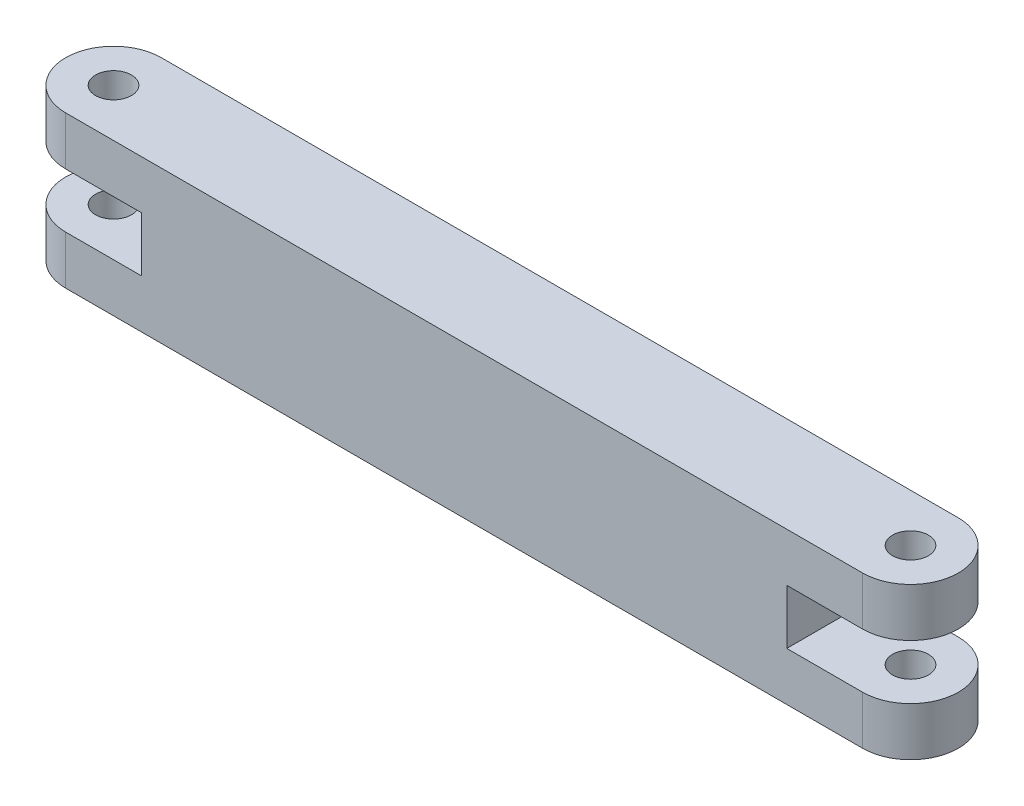
ISO-10303-21;
HEADER;
FILE_DESCRIPTION(('STEP AP214'),'2;1');
FILE_NAME('part.step','',(''),(''),'','','');
FILE_SCHEMA(('AUTOMOTIVE_DESIGN { 1 0 10303 214 1 1 1 1 }'));
ENDSEC;
DATA;
#1=APPLICATION_CONTEXT('core data for automotive mechanical design processes');
#2=APPLICATION_PROTOCOL_DEFINITION('international standard','automotive_design',2000,#1);
#3=PRODUCT_CONTEXT('',#1,'mechanical');
#4=PRODUCT('Part','Part','',(#3));
#5=PRODUCT_RELATED_PRODUCT_CATEGORY('part','',(#4));
#6=PRODUCT_DEFINITION_FORMATION('','',#4);
#7=PRODUCT_DEFINITION_CONTEXT('part definition',#1,'design');
#8=PRODUCT_DEFINITION('design','',#6,#7);
#9=PRODUCT_DEFINITION_SHAPE('','',#8);
#10=(LENGTH_UNIT() NAMED_UNIT(*) SI_UNIT(.MILLI.,.METRE.));
#11=(NAMED_UNIT(*) PLANE_ANGLE_UNIT() SI_UNIT($,.RADIAN.));
#12=(NAMED_UNIT(*) SI_UNIT($,.STERADIAN.) SOLID_ANGLE_UNIT());
#13=UNCERTAINTY_MEASURE_WITH_UNIT(LENGTH_MEASURE(1.E-05),#10,'distance_accuracy_value','');
#14=(GEOMETRIC_REPRESENTATION_CONTEXT(3) GLOBAL_UNCERTAINTY_ASSIGNED_CONTEXT((#13)) GLOBAL_UNIT_ASSIGNED_CONTEXT((#10,
#11,#12)) REPRESENTATION_CONTEXT('',''));
#15=CARTESIAN_POINT('',(0.,0.,0.));
#16=DIRECTION('',(0.,0.,1.));
#17=DIRECTION('',(1.,0.,0.));
#18=AXIS2_PLACEMENT_3D('',#15,#16,#17);
#19=CARTESIAN_POINT('',(0.,19.05,6.));
#20=DIRECTION('',(0.,0.,-1.));
#21=DIRECTION('',(-1.,0.,0.));
#22=AXIS2_PLACEMENT_3D('',#19,#20,#21);
#23=PLANE('',#22);
#24=DIRECTION('',(1.,0.,0.));
#25=VECTOR('',#24,1.);
#26=CARTESIAN_POINT('',(0.,6.096,6.));
#27=LINE('',#26,#25);
#28=CARTESIAN_POINT('',(90.475,6.09600000000001,6.));
#29=VERTEX_POINT('',#28);
#30=CARTESIAN_POINT('',(100.,6.09600000000001,6.));
#31=VERTEX_POINT('',#30);
#32=EDGE_CURVE('E156',#29,#31,#27,.T.);
#33=ORIENTED_EDGE('',*,*,#32,.F.);
#34=DIRECTION('',(0.,-1.,0.));
#35=VECTOR('',#34,1.);
#36=CARTESIAN_POINT('',(90.475,19.05,6.));
#37=LINE('',#36,#35);
#38=CARTESIAN_POINT('',(90.475,12.954,6.));
#39=VERTEX_POINT('',#38);
#40=EDGE_CURVE('E158',#39,#29,#37,.T.);
#41=ORIENTED_EDGE('',*,*,#40,.F.);
#42=DIRECTION('',(-1.,0.,0.));
#43=VECTOR('',#42,1.);
#44=CARTESIAN_POINT('',(0.,12.954,6.));
#45=LINE('',#44,#43);
#46=CARTESIAN_POINT('',(100.,12.954,6.));
#47=VERTEX_POINT('',#46);
#48=EDGE_CURVE('E131',#47,#39,#45,.T.);
#49=ORIENTED_EDGE('',*,*,#48,.F.);
#50=DIRECTION('',(0.,-1.,0.));
#51=VECTOR('',#50,1.);
#52=CARTESIAN_POINT('',(100.,19.05,6.));
#53=LINE('',#52,#51);
#54=CARTESIAN_POINT('',(100.,19.05,6.));
#55=VERTEX_POINT('',#54);
#56=EDGE_CURVE('E226',#55,#47,#53,.T.);
#57=ORIENTED_EDGE('',*,*,#56,.F.);
#58=DIRECTION('',(1.,0.,0.));
#59=VECTOR('',#58,1.);
#60=CARTESIAN_POINT('',(0.,19.05,6.));
#61=LINE('',#60,#59);
#62=CARTESIAN_POINT('',(0.,19.05,6.));
#63=VERTEX_POINT('',#62);
#64=EDGE_CURVE('E202',#63,#55,#61,.T.);
#65=ORIENTED_EDGE('',*,*,#64,.F.);
#66=DIRECTION('',(0.,-1.,0.));
#67=VECTOR('',#66,1.);
#68=CARTESIAN_POINT('',(0.,19.05,6.));
#69=LINE('',#68,#67);
#70=CARTESIAN_POINT('',(0.,12.954,6.));
#71=VERTEX_POINT('',#70);
#72=EDGE_CURVE('E11',#63,#71,#69,.T.);
#73=ORIENTED_EDGE('',*,*,#72,.T.);
#74=DIRECTION('',(1.,0.,0.));
#75=VECTOR('',#74,1.);
#76=CARTESIAN_POINT('',(0.,12.954,6.));
#77=LINE('',#76,#75);
#78=CARTESIAN_POINT('',(9.525,12.954,6.));
#79=VERTEX_POINT('',#78);
#80=EDGE_CURVE('E172',#71,#79,#77,.T.);
#81=ORIENTED_EDGE('',*,*,#80,.T.);
#82=DIRECTION('',(0.,-1.,0.));
#83=VECTOR('',#82,1.);
#84=CARTESIAN_POINT('',(9.525,19.05,6.));
#85=LINE('',#84,#83);
#86=CARTESIAN_POINT('',(9.525,6.09600000000001,6.));
#87=VERTEX_POINT('',#86);
#88=EDGE_CURVE('E183',#79,#87,#85,.T.);
#89=ORIENTED_EDGE('',*,*,#88,.T.);
#90=DIRECTION('',(-1.,0.,0.));
#91=VECTOR('',#90,1.);
#92=CARTESIAN_POINT('',(0.,6.09600000000001,6.));
#93=LINE('',#92,#91);
#94=CARTESIAN_POINT('',(0.,6.09600000000001,6.));
#95=VERTEX_POINT('',#94);
#96=EDGE_CURVE('E177',#87,#95,#93,.T.);
#97=ORIENTED_EDGE('',*,*,#96,.T.);
#98=CARTESIAN_POINT('',(0.,0.,6.));
#99=VERTEX_POINT('',#98);
#100=EDGE_CURVE('E41',#95,#99,#69,.T.);
#101=ORIENTED_EDGE('',*,*,#100,.T.);
#102=DIRECTION('',(1.,0.,0.));
#103=VECTOR('',#102,1.);
#104=CARTESIAN_POINT('',(0.,0.,6.));
#105=LINE('',#104,#103);
#106=CARTESIAN_POINT('',(100.,0.,6.));
#107=VERTEX_POINT('',#106);
#108=EDGE_CURVE('E212',#99,#107,#105,.T.);
#109=ORIENTED_EDGE('',*,*,#108,.T.);
#110=EDGE_CURVE('E225',#31,#107,#53,.T.);
#111=ORIENTED_EDGE('',*,*,#110,.F.);
#112=EDGE_LOOP('',(#33,#41,#49,#57,#65,#73,#81,#89,#97,#101,#109,#111));
#113=FACE_BOUND('',#112,.T.);
#114=ADVANCED_FACE('F32',(#113),#23,.F.);
#115=CARTESIAN_POINT('',(100.,19.05,0.));
#116=DIRECTION('',(0.,-1.,0.));
#117=DIRECTION('',(0.,0.,-1.));
#118=AXIS2_PLACEMENT_3D('',#115,#116,#117);
#119=CYLINDRICAL_SURFACE('',#118,6.);
#120=CARTESIAN_POINT('',(100.,6.09600000000001,0.));
#121=DIRECTION('',(0.,1.,0.));
#122=DIRECTION('',(-1.,0.,0.));
#123=AXIS2_PLACEMENT_3D('',#120,#121,#122);
#124=CIRCLE('',#123,6.);
#125=CARTESIAN_POINT('',(100.,6.09600000000001,-6.));
#126=VERTEX_POINT('',#125);
#127=EDGE_CURVE('E154',#31,#126,#124,.T.);
#128=ORIENTED_EDGE('',*,*,#127,.F.);
#129=ORIENTED_EDGE('',*,*,#110,.T.);
#130=CARTESIAN_POINT('',(100.,0.,0.));
#131=DIRECTION('',(0.,1.,0.));
#132=DIRECTION('',(0.,0.,1.));
#133=AXIS2_PLACEMENT_3D('',#130,#131,#132);
#134=CIRCLE('',#133,6.);
#135=CARTESIAN_POINT('',(100.,0.,-6.));
#136=VERTEX_POINT('',#135);
#137=EDGE_CURVE('E215',#107,#136,#134,.T.);
#138=ORIENTED_EDGE('',*,*,#137,.T.);
#139=DIRECTION('',(0.,-1.,0.));
#140=VECTOR('',#139,1.);
#141=CARTESIAN_POINT('',(100.,19.05,-6.));
#142=LINE('',#141,#140);
#143=EDGE_CURVE('E223',#126,#136,#142,.T.);
#144=ORIENTED_EDGE('',*,*,#143,.F.);
#145=EDGE_LOOP('',(#128,#129,#138,#144));
#146=FACE_BOUND('',#145,.T.);
#147=ADVANCED_FACE('F247',(#146),#119,.T.);
#148=CARTESIAN_POINT('',(100.,12.954,0.));
#149=DIRECTION('',(0.,-1.,0.));
#150=DIRECTION('',(1.,0.,0.));
#151=AXIS2_PLACEMENT_3D('',#148,#149,#150);
#152=CIRCLE('',#151,6.);
#153=CARTESIAN_POINT('',(100.,12.954,-6.));
#154=VERTEX_POINT('',#153);
#155=EDGE_CURVE('E151',#154,#47,#152,.T.);
#156=ORIENTED_EDGE('',*,*,#155,.F.);
#157=CARTESIAN_POINT('',(100.,19.05,-6.));
#158=VERTEX_POINT('',#157);
#159=EDGE_CURVE('E146',#158,#154,#142,.T.);
#160=ORIENTED_EDGE('',*,*,#159,.F.);
#161=CARTESIAN_POINT('',(100.,19.05,0.));
#162=DIRECTION('',(0.,1.,0.));
#163=DIRECTION('',(0.,0.,1.));
#164=AXIS2_PLACEMENT_3D('',#161,#162,#163);
#165=CIRCLE('',#164,6.);
#166=EDGE_CURVE('E205',#55,#158,#165,.T.);
#167=ORIENTED_EDGE('',*,*,#166,.F.);
#168=ORIENTED_EDGE('',*,*,#56,.T.);
#169=EDGE_LOOP('',(#156,#160,#167,#168));
#170=FACE_BOUND('',#169,.T.);
#171=ADVANCED_FACE('F252',(#170),#119,.T.);
#172=CARTESIAN_POINT('',(0.,19.05,-6.));
#173=DIRECTION('',(0.,0.,1.));
#174=DIRECTION('',(1.,0.,0.));
#175=AXIS2_PLACEMENT_3D('',#172,#173,#174);
#176=PLANE('',#175);
#177=DIRECTION('',(1.,0.,0.));
#178=VECTOR('',#177,1.);
#179=CARTESIAN_POINT('',(113.5,6.09600000000001,-6.));
#180=LINE('',#179,#178);
#181=CARTESIAN_POINT('',(90.475,6.09600000000001,-6.));
#182=VERTEX_POINT('',#181);
#183=EDGE_CURVE('E49',#182,#126,#180,.T.);
#184=ORIENTED_EDGE('',*,*,#183,.T.);
#185=ORIENTED_EDGE('',*,*,#143,.T.);
#186=DIRECTION('',(-1.,0.,0.));
#187=VECTOR('',#186,1.);
#188=CARTESIAN_POINT('',(0.,0.,-6.));
#189=LINE('',#188,#187);
#190=CARTESIAN_POINT('',(0.,0.,-6.));
#191=VERTEX_POINT('',#190);
#192=EDGE_CURVE('E203',#136,#191,#189,.T.);
#193=ORIENTED_EDGE('',*,*,#192,.T.);
#194=DIRECTION('',(0.,-1.,0.));
#195=VECTOR('',#194,1.);
#196=CARTESIAN_POINT('',(0.,19.05,-6.));
#197=LINE('',#196,#195);
#198=CARTESIAN_POINT('',(0.,6.09600000000001,-6.));
#199=VERTEX_POINT('',#198);
#200=EDGE_CURVE('E209',#199,#191,#197,.T.);
#201=ORIENTED_EDGE('',*,*,#200,.F.);
#202=DIRECTION('',(-1.,0.,0.));
#203=VECTOR('',#202,1.);
#204=CARTESIAN_POINT('',(-13.5,6.09600000000001,-6.));
#205=LINE('',#204,#203);
#206=CARTESIAN_POINT('',(9.525,6.09600000000001,-6.));
#207=VERTEX_POINT('',#206);
#208=EDGE_CURVE('E160',#207,#199,#205,.T.);
#209=ORIENTED_EDGE('',*,*,#208,.F.);
#210=DIRECTION('',(0.,-1.,0.));
#211=VECTOR('',#210,1.);
#212=CARTESIAN_POINT('',(9.525,12.954,-6.));
#213=LINE('',#212,#211);
#214=CARTESIAN_POINT('',(9.525,12.954,-6.));
#215=VERTEX_POINT('',#214);
#216=EDGE_CURVE('E164',#215,#207,#213,.T.);
#217=ORIENTED_EDGE('',*,*,#216,.F.);
#218=DIRECTION('',(1.,0.,0.));
#219=VECTOR('',#218,1.);
#220=CARTESIAN_POINT('',(-13.5,12.954,-6.));
#221=LINE('',#220,#219);
#222=CARTESIAN_POINT('',(0.,12.954,-6.));
#223=VERTEX_POINT('',#222);
#224=EDGE_CURVE('E162',#223,#215,#221,.T.);
#225=ORIENTED_EDGE('',*,*,#224,.F.);
#226=CARTESIAN_POINT('',(0.,19.05,-6.));
#227=VERTEX_POINT('',#226);
#228=EDGE_CURVE('E220',#227,#223,#197,.T.);
#229=ORIENTED_EDGE('',*,*,#228,.F.);
#230=DIRECTION('',(-1.,0.,0.));
#231=VECTOR('',#230,1.);
#232=CARTESIAN_POINT('',(0.,19.05,-6.));
#233=LINE('',#232,#231);
#234=EDGE_CURVE('E207',#158,#227,#233,.T.);
#235=ORIENTED_EDGE('',*,*,#234,.F.);
#236=ORIENTED_EDGE('',*,*,#159,.T.);
#237=DIRECTION('',(-1.,0.,0.));
#238=VECTOR('',#237,1.);
#239=CARTESIAN_POINT('',(113.5,12.954,-6.));
#240=LINE('',#239,#238);
#241=CARTESIAN_POINT('',(90.475,12.954,-6.));
#242=VERTEX_POINT('',#241);
#243=EDGE_CURVE('E128',#154,#242,#240,.T.);
#244=ORIENTED_EDGE('',*,*,#243,.T.);
#245=DIRECTION('',(0.,-1.,0.));
#246=VECTOR('',#245,1.);
#247=CARTESIAN_POINT('',(90.475,12.954,-6.));
#248=LINE('',#247,#246);
#249=EDGE_CURVE('E138',#242,#182,#248,.T.);
#250=ORIENTED_EDGE('',*,*,#249,.T.);
#251=EDGE_LOOP('',(#184,#185,#193,#201,#209,#217,#225,#229,#235,#236,#244,#250));
#252=FACE_BOUND('',#251,.T.);
#253=ADVANCED_FACE('F143',(#252),#176,.F.);
#254=CARTESIAN_POINT('',(100.,19.05,0.));
#255=DIRECTION('',(0.,-1.,0.));
#256=DIRECTION('',(0.,0.,-1.));
#257=AXIS2_PLACEMENT_3D('',#254,#255,#256);
#258=CYLINDRICAL_SURFACE('',#257,2.25);
#259=CARTESIAN_POINT('',(100.,0.,0.));
#260=DIRECTION('',(0.,1.,0.));
#261=DIRECTION('',(0.,0.,1.));
#262=AXIS2_PLACEMENT_3D('',#259,#260,#261);
#263=CIRCLE('',#262,2.25);
#264=CARTESIAN_POINT('',(100.,0.,-2.25));
#265=VERTEX_POINT('',#264);
#266=EDGE_CURVE('E186',#265,#265,#263,.T.);
#267=CARTESIAN_POINT('',(100.,6.09600000000001,0.));
#268=DIRECTION('',(0.,1.,0.));
#269=DIRECTION('',(-1.,0.,0.));
#270=AXIS2_PLACEMENT_3D('',#267,#268,#269);
#271=CIRCLE('',#270,2.25);
#272=CARTESIAN_POINT('',(100.,6.09600000000001,-2.25));
#273=VERTEX_POINT('',#272);
#274=EDGE_CURVE('E36',#273,#273,#271,.T.);
#275=CARTESIAN_POINT('',(100.,0.,-2.25));
#276=CARTESIAN_POINT('',(100.,0.0635,-2.25));
#277=CARTESIAN_POINT('',(100.,0.127,-2.25));
#278=CARTESIAN_POINT('',(100.,0.254,-2.25));
#279=CARTESIAN_POINT('',(100.,0.3175,-2.25));
#280=CARTESIAN_POINT('',(100.,0.444499999999999,-2.25));
#281=CARTESIAN_POINT('',(100.,0.507999999999999,-2.25));
#282=CARTESIAN_POINT('',(100.,0.635,-2.25));
#283=CARTESIAN_POINT('',(100.,0.698500000000001,-2.25));
#284=CARTESIAN_POINT('',(100.,0.825500000000002,-2.25));
#285=CARTESIAN_POINT('',(100.,0.889000000000002,-2.25));
#286=CARTESIAN_POINT('',(100.,1.016,-2.25));
#287=CARTESIAN_POINT('',(100.,1.0795,-2.25));
#288=CARTESIAN_POINT('',(100.,1.2065,-2.25));
#289=CARTESIAN_POINT('',(100.,1.27,-2.25));
#290=CARTESIAN_POINT('',(100.,1.397,-2.25));
#291=CARTESIAN_POINT('',(100.,1.4605,-2.25));
#292=CARTESIAN_POINT('',(100.,1.5875,-2.25));
#293=CARTESIAN_POINT('',(100.,1.651,-2.25));
#294=CARTESIAN_POINT('',(100.,1.778,-2.25));
#295=CARTESIAN_POINT('',(100.,1.8415,-2.25));
#296=CARTESIAN_POINT('',(100.,1.9685,-2.25));
#297=CARTESIAN_POINT('',(100.,2.032,-2.25));
#298=CARTESIAN_POINT('',(100.,2.159,-2.25));
#299=CARTESIAN_POINT('',(100.,2.2225,-2.25));
#300=CARTESIAN_POINT('',(100.,2.3495,-2.25));
#301=CARTESIAN_POINT('',(100.,2.413,-2.25));
#302=CARTESIAN_POINT('',(100.,2.54,-2.25));
#303=CARTESIAN_POINT('',(100.,2.6035,-2.25));
#304=CARTESIAN_POINT('',(100.,2.7305,-2.25));
#305=CARTESIAN_POINT('',(100.,2.794,-2.25));
#306=CARTESIAN_POINT('',(100.,2.921,-2.25));
#307=CARTESIAN_POINT('',(100.,2.9845,-2.25));
#308=CARTESIAN_POINT('',(100.,3.1115,-2.25));
#309=CARTESIAN_POINT('',(100.,3.175,-2.25));
#310=CARTESIAN_POINT('',(100.,3.302,-2.25));
#311=CARTESIAN_POINT('',(100.,3.3655,-2.25));
#312=CARTESIAN_POINT('',(100.,3.4925,-2.25));
#313=CARTESIAN_POINT('',(100.,3.556,-2.25));
#314=CARTESIAN_POINT('',(100.,3.683,-2.25));
#315=CARTESIAN_POINT('',(100.,3.7465,-2.25));
#316=CARTESIAN_POINT('',(100.,3.8735,-2.25));
#317=CARTESIAN_POINT('',(100.,3.937,-2.25));
#318=CARTESIAN_POINT('',(100.,4.064,-2.25));
#319=CARTESIAN_POINT('',(100.,4.1275,-2.25));
#320=CARTESIAN_POINT('',(100.,4.2545,-2.25));
#321=CARTESIAN_POINT('',(100.,4.318,-2.25));
#322=CARTESIAN_POINT('',(100.,4.445,-2.25));
#323=CARTESIAN_POINT('',(100.,4.50850000000001,-2.25));
#324=CARTESIAN_POINT('',(100.,4.6355,-2.25));
#325=CARTESIAN_POINT('',(100.,4.699,-2.25));
#326=CARTESIAN_POINT('',(100.,4.826,-2.25));
#327=CARTESIAN_POINT('',(100.,4.8895,-2.25));
#328=CARTESIAN_POINT('',(100.,5.0165,-2.25));
#329=CARTESIAN_POINT('',(100.,5.08,-2.25));
#330=CARTESIAN_POINT('',(100.,5.207,-2.25));
#331=CARTESIAN_POINT('',(100.,5.27050000000001,-2.25));
#332=CARTESIAN_POINT('',(100.,5.39750000000001,-2.25));
#333=CARTESIAN_POINT('',(100.,5.461,-2.25));
#334=CARTESIAN_POINT('',(100.,5.58800000000001,-2.25));
#335=CARTESIAN_POINT('',(100.,5.65150000000001,-2.25));
#336=CARTESIAN_POINT('',(100.,5.77850000000001,-2.25));
#337=CARTESIAN_POINT('',(100.,5.84200000000001,-2.25));
#338=CARTESIAN_POINT('',(100.,5.96900000000001,-2.25));
#339=CARTESIAN_POINT('',(100.,6.03250000000001,-2.25));
#340=CARTESIAN_POINT('',(100.,6.09600000000001,-2.25));
#341=B_SPLINE_CURVE_WITH_KNOTS('',3,(#275,#276,#277,#278,#279,#280,#281,#282,#283,#284,#285,
#286,#287,#288,#289,#290,#291,#292,#293,#294,#295,#296,#297,#298,#299,#300,#301,#302,#303,#304,
#305,#306,#307,#308,#309,#310,#311,#312,#313,#314,#315,#316,#317,#318,#319,#320,#321,#322,#323,
#324,#325,#326,#327,#328,#329,#330,#331,#332,#333,#334,#335,#336,#337,#338,#339,#340),
.UNSPECIFIED.,.F.,.F.,(4,2,2,2,2,2,2,2,2,2,2,2,2,2,2,2,2,2,2,2,2,2,2,2,2,2,2,2,2,2,2,2,4),(0.,
0.1905,0.380999999999999,0.571499999999999,0.762000000000002,0.952500000000002,1.143,1.3335,
1.524,1.7145,1.905,2.0955,2.286,2.4765,2.667,2.8575,3.048,3.23850000000001,3.429,3.6195,3.81,
4.0005,4.191,4.3815,4.572,4.7625,4.953,5.1435,5.334,5.52450000000001,5.71500000000001,
5.90550000000001,6.09600000000001),.UNSPECIFIED.);
#342=EDGE_CURVE('BSEAM259',#265,#273,#341,.T.);
#343=ORIENTED_EDGE('',*,*,#266,.F.);
#344=ORIENTED_EDGE('',*,*,#274,.T.);
#345=ORIENTED_EDGE('',*,*,#342,.T.);
#346=ORIENTED_EDGE('',*,*,#342,.F.);
#347=EDGE_LOOP('',(#343,#345,#344,#346));
#348=FACE_BOUND('',#347,.T.);
#349=ADVANCED_FACE('F259',(#348),#258,.F.);
#350=CARTESIAN_POINT('',(100.,19.05,0.));
#351=DIRECTION('',(0.,1.,0.));
#352=DIRECTION('',(0.,0.,1.));
#353=AXIS2_PLACEMENT_3D('',#350,#351,#352);
#354=CIRCLE('',#353,2.25);
#355=CARTESIAN_POINT('',(100.,19.05,-2.25));
#356=VERTEX_POINT('',#355);
#357=EDGE_CURVE('E187',#356,#356,#354,.T.);
#358=CARTESIAN_POINT('',(100.,12.954,0.));
#359=DIRECTION('',(0.,-1.,0.));
#360=DIRECTION('',(1.,0.,0.));
#361=AXIS2_PLACEMENT_3D('',#358,#359,#360);
#362=CIRCLE('',#361,2.25);
#363=CARTESIAN_POINT('',(100.,12.954,-2.25));
#364=VERTEX_POINT('',#363);
#365=EDGE_CURVE('E134',#364,#364,#362,.T.);
#366=CARTESIAN_POINT('',(100.,19.05,-2.25));
#367=CARTESIAN_POINT('',(100.,18.9865,-2.25));
#368=CARTESIAN_POINT('',(100.,18.923,-2.25));
#369=CARTESIAN_POINT('',(100.,18.796,-2.25));
#370=CARTESIAN_POINT('',(100.,18.7325,-2.25));
#371=CARTESIAN_POINT('',(100.,18.6055,-2.25));
#372=CARTESIAN_POINT('',(100.,18.542,-2.25));
#373=CARTESIAN_POINT('',(100.,18.415,-2.25));
#374=CARTESIAN_POINT('',(100.,18.3515,-2.25));
#375=CARTESIAN_POINT('',(100.,18.2245,-2.25));
#376=CARTESIAN_POINT('',(100.,18.161,-2.25));
#377=CARTESIAN_POINT('',(100.,18.034,-2.25));
#378=CARTESIAN_POINT('',(100.,17.9705,-2.25));
#379=CARTESIAN_POINT('',(100.,17.8435,-2.25));
#380=CARTESIAN_POINT('',(100.,17.78,-2.25));
#381=CARTESIAN_POINT('',(100.,17.653,-2.25));
#382=CARTESIAN_POINT('',(100.,17.5895,-2.25));
#383=CARTESIAN_POINT('',(100.,17.4625,-2.25));
#384=CARTESIAN_POINT('',(100.,17.399,-2.25));
#385=CARTESIAN_POINT('',(100.,17.272,-2.25));
#386=CARTESIAN_POINT('',(100.,17.2085,-2.25));
#387=CARTESIAN_POINT('',(100.,17.0815,-2.25));
#388=CARTESIAN_POINT('',(100.,17.018,-2.25));
#389=CARTESIAN_POINT('',(100.,16.891,-2.25));
#390=CARTESIAN_POINT('',(100.,16.8275,-2.25));
#391=CARTESIAN_POINT('',(100.,16.7005,-2.25));
#392=CARTESIAN_POINT('',(100.,16.637,-2.25));
#393=CARTESIAN_POINT('',(100.,16.51,-2.25));
#394=CARTESIAN_POINT('',(100.,16.4465,-2.25));
#395=CARTESIAN_POINT('',(100.,16.3195,-2.25));
#396=CARTESIAN_POINT('',(100.,16.256,-2.25));
#397=CARTESIAN_POINT('',(100.,16.129,-2.25));
#398=CARTESIAN_POINT('',(100.,16.0655,-2.25));
#399=CARTESIAN_POINT('',(100.,15.9385,-2.25));
#400=CARTESIAN_POINT('',(100.,15.875,-2.25));
#401=CARTESIAN_POINT('',(100.,15.748,-2.25));
#402=CARTESIAN_POINT('',(100.,15.6845,-2.25));
#403=CARTESIAN_POINT('',(100.,15.5575,-2.25));
#404=CARTESIAN_POINT('',(100.,15.494,-2.25));
#405=CARTESIAN_POINT('',(100.,15.367,-2.25));
#406=CARTESIAN_POINT('',(100.,15.3035,-2.25));
#407=CARTESIAN_POINT('',(100.,15.1765,-2.25));
#408=CARTESIAN_POINT('',(100.,15.113,-2.25));
#409=CARTESIAN_POINT('',(100.,14.986,-2.25));
#410=CARTESIAN_POINT('',(100.,14.9225,-2.25));
#411=CARTESIAN_POINT('',(100.,14.7955,-2.25));
#412=CARTESIAN_POINT('',(100.,14.732,-2.25));
#413=CARTESIAN_POINT('',(100.,14.605,-2.25));
#414=CARTESIAN_POINT('',(100.,14.5415,-2.25));
#415=CARTESIAN_POINT('',(100.,14.4145,-2.25));
#416=CARTESIAN_POINT('',(100.,14.351,-2.25));
#417=CARTESIAN_POINT('',(100.,14.224,-2.25));
#418=CARTESIAN_POINT('',(100.,14.1605,-2.25));
#419=CARTESIAN_POINT('',(100.,14.0335,-2.25));
#420=CARTESIAN_POINT('',(100.,13.97,-2.25));
#421=CARTESIAN_POINT('',(100.,13.843,-2.25));
#422=CARTESIAN_POINT('',(100.,13.7795,-2.25));
#423=CARTESIAN_POINT('',(100.,13.6525,-2.25));
#424=CARTESIAN_POINT('',(100.,13.589,-2.25));
#425=CARTESIAN_POINT('',(100.,13.462,-2.25));
#426=CARTESIAN_POINT('',(100.,13.3985,-2.25));
#427=CARTESIAN_POINT('',(100.,13.2715,-2.25));
#428=CARTESIAN_POINT('',(100.,13.208,-2.25));
#429=CARTESIAN_POINT('',(100.,13.081,-2.25));
#430=CARTESIAN_POINT('',(100.,13.0175,-2.25));
#431=CARTESIAN_POINT('',(100.,12.954,-2.25));
#432=B_SPLINE_CURVE_WITH_KNOTS('',3,(#366,#367,#368,#369,#370,#371,#372,#373,#374,#375,#376,
#377,#378,#379,#380,#381,#382,#383,#384,#385,#386,#387,#388,#389,#390,#391,#392,#393,#394,#395,
#396,#397,#398,#399,#400,#401,#402,#403,#404,#405,#406,#407,#408,#409,#410,#411,#412,#413,#414,
#415,#416,#417,#418,#419,#420,#421,#422,#423,#424,#425,#426,#427,#428,#429,#430,#431),
.UNSPECIFIED.,.F.,.F.,(4,2,2,2,2,2,2,2,2,2,2,2,2,2,2,2,2,2,2,2,2,2,2,2,2,2,2,2,2,2,2,2,4),(0.,
0.1905,0.380999999999999,0.571499999999999,0.761999999999999,0.952499999999998,1.143,1.3335,
1.524,1.7145,1.905,2.09549999999999,2.286,2.4765,2.667,2.8575,3.048,3.23849999999999,
3.42899999999999,3.61949999999999,3.80999999999999,4.00049999999999,4.19099999999999,
4.38149999999999,4.57199999999999,4.76249999999999,4.95299999999999,5.14349999999999,
5.33399999999999,5.52449999999999,5.71499999999999,5.90549999999999,6.09599999999999),.UNSPECIFIED.);
#433=EDGE_CURVE('BSEAM235',#356,#364,#432,.T.);
#434=ORIENTED_EDGE('',*,*,#357,.T.);
#435=ORIENTED_EDGE('',*,*,#365,.T.);
#436=ORIENTED_EDGE('',*,*,#433,.T.);
#437=ORIENTED_EDGE('',*,*,#433,.F.);
#438=EDGE_LOOP('',(#434,#436,#435,#437));
#439=FACE_BOUND('',#438,.T.);
#440=ADVANCED_FACE('F235',(#439),#258,.F.);
#441=CARTESIAN_POINT('',(0.,19.05,0.));
#442=DIRECTION('',(0.,-1.,0.));
#443=DIRECTION('',(0.,0.,-1.));
#444=AXIS2_PLACEMENT_3D('',#441,#442,#443);
#445=CYLINDRICAL_SURFACE('',#444,6.);
#446=ORIENTED_EDGE('',*,*,#100,.F.);
#447=CARTESIAN_POINT('',(0.,6.09600000000001,0.));
#448=DIRECTION('',(0.,-1.,0.));
#449=DIRECTION('',(1.,0.,0.));
#450=AXIS2_PLACEMENT_3D('',#447,#448,#449);
#451=CIRCLE('',#450,6.);
#452=EDGE_CURVE('E180',#95,#199,#451,.T.);
#453=ORIENTED_EDGE('',*,*,#452,.T.);
#454=ORIENTED_EDGE('',*,*,#200,.T.);
#455=CARTESIAN_POINT('',(0.,0.,0.));
#456=DIRECTION('',(0.,1.,0.));
#457=DIRECTION('',(0.,0.,1.));
#458=AXIS2_PLACEMENT_3D('',#455,#456,#457);
#459=CIRCLE('',#458,6.);
#460=EDGE_CURVE('E196',#191,#99,#459,.T.);
#461=ORIENTED_EDGE('',*,*,#460,.T.);
#462=EDGE_LOOP('',(#446,#453,#454,#461));
#463=FACE_BOUND('',#462,.T.);
#464=ADVANCED_FACE('F338',(#463),#445,.T.);
#465=CARTESIAN_POINT('',(0.,19.05,0.));
#466=DIRECTION('',(0.,-1.,0.));
#467=DIRECTION('',(0.,0.,-1.));
#468=AXIS2_PLACEMENT_3D('',#465,#466,#467);
#469=CYLINDRICAL_SURFACE('',#468,2.25);
#470=CARTESIAN_POINT('',(0.,6.09600000000001,0.));
#471=DIRECTION('',(0.,-1.,0.));
#472=DIRECTION('',(1.,0.,0.));
#473=AXIS2_PLACEMENT_3D('',#470,#471,#472);
#474=CIRCLE('',#473,2.25);
#475=CARTESIAN_POINT('',(0.,6.09600000000001,-2.25));
#476=VERTEX_POINT('',#475);
#477=EDGE_CURVE('E176',#476,#476,#474,.T.);
#478=CARTESIAN_POINT('',(0.,0.,0.));
#479=DIRECTION('',(0.,1.,0.));
#480=DIRECTION('',(0.,0.,1.));
#481=AXIS2_PLACEMENT_3D('',#478,#479,#480);
#482=CIRCLE('',#481,2.25);
#483=CARTESIAN_POINT('',(0.,0.,-2.25));
#484=VERTEX_POINT('',#483);
#485=EDGE_CURVE('E190',#484,#484,#482,.T.);
#486=CARTESIAN_POINT('',(0.,6.09600000000001,-2.25));
#487=CARTESIAN_POINT('',(0.,6.03250000000001,-2.25));
#488=CARTESIAN_POINT('',(0.,5.96900000000001,-2.25));
#489=CARTESIAN_POINT('',(0.,5.84200000000001,-2.25));
#490=CARTESIAN_POINT('',(0.,5.7785,-2.25));
#491=CARTESIAN_POINT('',(0.,5.6515,-2.25));
#492=CARTESIAN_POINT('',(0.,5.58800000000001,-2.25));
#493=CARTESIAN_POINT('',(0.,5.461,-2.25));
#494=CARTESIAN_POINT('',(0.,5.39750000000001,-2.25));
#495=CARTESIAN_POINT('',(0.,5.27050000000001,-2.25));
#496=CARTESIAN_POINT('',(0.,5.207,-2.25));
#497=CARTESIAN_POINT('',(0.,5.08,-2.25));
#498=CARTESIAN_POINT('',(0.,5.0165,-2.25));
#499=CARTESIAN_POINT('',(0.,4.8895,-2.25));
#500=CARTESIAN_POINT('',(0.,4.826,-2.25));
#501=CARTESIAN_POINT('',(0.,4.699,-2.25));
#502=CARTESIAN_POINT('',(0.,4.6355,-2.25));
#503=CARTESIAN_POINT('',(0.,4.50850000000001,-2.25));
#504=CARTESIAN_POINT('',(0.,4.445,-2.25));
#505=CARTESIAN_POINT('',(0.,4.318,-2.25));
#506=CARTESIAN_POINT('',(0.,4.2545,-2.25));
#507=CARTESIAN_POINT('',(0.,4.1275,-2.25));
#508=CARTESIAN_POINT('',(0.,4.064,-2.25));
#509=CARTESIAN_POINT('',(0.,3.937,-2.25));
#510=CARTESIAN_POINT('',(0.,3.8735,-2.25));
#511=CARTESIAN_POINT('',(0.,3.7465,-2.25));
#512=CARTESIAN_POINT('',(0.,3.683,-2.25));
#513=CARTESIAN_POINT('',(0.,3.556,-2.25));
#514=CARTESIAN_POINT('',(0.,3.4925,-2.25));
#515=CARTESIAN_POINT('',(0.,3.3655,-2.25));
#516=CARTESIAN_POINT('',(0.,3.302,-2.25));
#517=CARTESIAN_POINT('',(0.,3.175,-2.25));
#518=CARTESIAN_POINT('',(0.,3.1115,-2.25));
#519=CARTESIAN_POINT('',(0.,2.9845,-2.25));
#520=CARTESIAN_POINT('',(0.,2.921,-2.25));
#521=CARTESIAN_POINT('',(0.,2.794,-2.25));
#522=CARTESIAN_POINT('',(0.,2.7305,-2.25));
#523=CARTESIAN_POINT('',(0.,2.6035,-2.25));
#524=CARTESIAN_POINT('',(0.,2.54,-2.25));
#525=CARTESIAN_POINT('',(0.,2.413,-2.25));
#526=CARTESIAN_POINT('',(0.,2.3495,-2.25));
#527=CARTESIAN_POINT('',(0.,2.2225,-2.25));
#528=CARTESIAN_POINT('',(0.,2.159,-2.25));
#529=CARTESIAN_POINT('',(0.,2.032,-2.25));
#530=CARTESIAN_POINT('',(0.,1.9685,-2.25));
#531=CARTESIAN_POINT('',(0.,1.8415,-2.25));
#532=CARTESIAN_POINT('',(0.,1.778,-2.25));
#533=CARTESIAN_POINT('',(0.,1.651,-2.25));
#534=CARTESIAN_POINT('',(0.,1.5875,-2.25));
#535=CARTESIAN_POINT('',(0.,1.4605,-2.25));
#536=CARTESIAN_POINT('',(0.,1.397,-2.25));
#537=CARTESIAN_POINT('',(0.,1.27,-2.25));
#538=CARTESIAN_POINT('',(0.,1.2065,-2.25));
#539=CARTESIAN_POINT('',(0.,1.0795,-2.25));
#540=CARTESIAN_POINT('',(0.,1.016,-2.25));
#541=CARTESIAN_POINT('',(0.,0.889000000000001,-2.25));
#542=CARTESIAN_POINT('',(0.,0.8255,-2.25));
#543=CARTESIAN_POINT('',(0.,0.6985,-2.25));
#544=CARTESIAN_POINT('',(0.,0.635000000000001,-2.25));
#545=CARTESIAN_POINT('',(0.,0.508000000000002,-2.25));
#546=CARTESIAN_POINT('',(0.,0.4445,-2.25));
#547=CARTESIAN_POINT('',(0.,0.3175,-2.25));
#548=CARTESIAN_POINT('',(0.,0.254,-2.25));
#549=CARTESIAN_POINT('',(0.,0.127,-2.25));
#550=CARTESIAN_POINT('',(0.,0.0635,-2.25));
#551=CARTESIAN_POINT('',(0.,0.,-2.25));
#552=B_SPLINE_CURVE_WITH_KNOTS('',3,(#486,#487,#488,#489,#490,#491,#492,#493,#494,#495,#496,
#497,#498,#499,#500,#501,#502,#503,#504,#505,#506,#507,#508,#509,#510,#511,#512,#513,#514,#515,
#516,#517,#518,#519,#520,#521,#522,#523,#524,#525,#526,#527,#528,#529,#530,#531,#532,#533,#534,
#535,#536,#537,#538,#539,#540,#541,#542,#543,#544,#545,#546,#547,#548,#549,#550,#551),
.UNSPECIFIED.,.F.,.F.,(4,2,2,2,2,2,2,2,2,2,2,2,2,2,2,2,2,2,2,2,2,2,2,2,2,2,2,2,2,2,2,2,4),(0.,
0.1905,0.381000000000001,0.571500000000001,0.762000000000001,0.952500000000002,1.143,1.3335,
1.524,1.7145,1.905,2.0955,2.286,2.4765,2.667,2.8575,3.048,3.2385,3.429,3.6195,3.81,4.0005,4.191,
4.38150000000001,4.572,4.7625,4.953,5.1435,5.33400000000001,5.5245,5.71500000000001,
5.90550000000001,6.09600000000001),.UNSPECIFIED.);
#553=EDGE_CURVE('BSEAM267',#476,#484,#552,.T.);
#554=ORIENTED_EDGE('',*,*,#477,.F.);
#555=ORIENTED_EDGE('',*,*,#485,.F.);
#556=ORIENTED_EDGE('',*,*,#553,.T.);
#557=ORIENTED_EDGE('',*,*,#553,.F.);
#558=EDGE_LOOP('',(#554,#556,#555,#557));
#559=FACE_BOUND('',#558,.T.);
#560=ADVANCED_FACE('F267',(#559),#469,.F.);
#561=CARTESIAN_POINT('',(0.,19.05,0.));
#562=DIRECTION('',(0.,1.,0.));
#563=DIRECTION('',(0.,0.,1.));
#564=AXIS2_PLACEMENT_3D('',#561,#562,#563);
#565=PLANE('',#564);
#566=CARTESIAN_POINT('',(0.,19.05,0.));
#567=DIRECTION('',(0.,1.,0.));
#568=DIRECTION('',(0.,0.,1.));
#569=AXIS2_PLACEMENT_3D('',#566,#567,#568);
#570=CIRCLE('',#569,2.25);
#571=CARTESIAN_POINT('',(0.,19.05,-2.25));
#572=VERTEX_POINT('',#571);
#573=EDGE_CURVE('E193',#572,#572,#570,.T.);
#574=ORIENTED_EDGE('',*,*,#573,.F.);
#575=EDGE_LOOP('',(#574));
#576=FACE_BOUND('',#575,.T.);
#577=CARTESIAN_POINT('',(0.,19.05,0.));
#578=DIRECTION('',(0.,1.,0.));
#579=DIRECTION('',(0.,0.,1.));
#580=AXIS2_PLACEMENT_3D('',#577,#578,#579);
#581=CIRCLE('',#580,6.);
#582=EDGE_CURVE('E199',#227,#63,#581,.T.);
#583=ORIENTED_EDGE('',*,*,#582,.T.);
#584=ORIENTED_EDGE('',*,*,#64,.T.);
#585=ORIENTED_EDGE('',*,*,#166,.T.);
#586=ORIENTED_EDGE('',*,*,#234,.T.);
#587=EDGE_LOOP('',(#583,#584,#585,#586));
#588=FACE_BOUND('',#587,.T.);
#589=ORIENTED_EDGE('',*,*,#357,.F.);
#590=EDGE_LOOP('',(#589));
#591=FACE_BOUND('',#590,.T.);
#592=ADVANCED_FACE('F263',(#576,#588,#591),#565,.T.);
#593=CARTESIAN_POINT('',(0.,0.,0.));
#594=DIRECTION('',(0.,1.,0.));
#595=DIRECTION('',(0.,0.,1.));
#596=AXIS2_PLACEMENT_3D('',#593,#594,#595);
#597=PLANE('',#596);
#598=ORIENTED_EDGE('',*,*,#460,.F.);
#599=ORIENTED_EDGE('',*,*,#192,.F.);
#600=ORIENTED_EDGE('',*,*,#137,.F.);
#601=ORIENTED_EDGE('',*,*,#108,.F.);
#602=EDGE_LOOP('',(#598,#599,#600,#601));
#603=FACE_BOUND('',#602,.T.);
#604=ORIENTED_EDGE('',*,*,#485,.T.);
#605=EDGE_LOOP('',(#604));
#606=FACE_BOUND('',#605,.T.);
#607=ORIENTED_EDGE('',*,*,#266,.T.);
#608=EDGE_LOOP('',(#607));
#609=FACE_BOUND('',#608,.T.);
#610=ADVANCED_FACE('F260',(#603,#606,#609),#597,.F.);
#611=ORIENTED_EDGE('',*,*,#228,.T.);
#612=CARTESIAN_POINT('',(0.,12.954,0.));
#613=DIRECTION('',(0.,1.,0.));
#614=DIRECTION('',(-1.,0.,0.));
#615=AXIS2_PLACEMENT_3D('',#612,#613,#614);
#616=CIRCLE('',#615,6.);
#617=EDGE_CURVE('E57',#223,#71,#616,.T.);
#618=ORIENTED_EDGE('',*,*,#617,.T.);
#619=ORIENTED_EDGE('',*,*,#72,.F.);
#620=ORIENTED_EDGE('',*,*,#582,.F.);
#621=EDGE_LOOP('',(#611,#618,#619,#620));
#622=FACE_BOUND('',#621,.T.);
#623=ADVANCED_FACE('F34',(#622),#445,.T.);
#624=CARTESIAN_POINT('',(0.,12.954,0.));
#625=DIRECTION('',(0.,1.,0.));
#626=DIRECTION('',(-1.,0.,0.));
#627=AXIS2_PLACEMENT_3D('',#624,#625,#626);
#628=CIRCLE('',#627,2.25);
#629=CARTESIAN_POINT('',(0.,12.954,-2.25));
#630=VERTEX_POINT('',#629);
#631=EDGE_CURVE('E170',#630,#630,#628,.T.);
#632=CARTESIAN_POINT('',(0.,12.954,-2.25));
#633=CARTESIAN_POINT('',(0.,13.0175,-2.25));
#634=CARTESIAN_POINT('',(0.,13.081,-2.25));
#635=CARTESIAN_POINT('',(0.,13.208,-2.25));
#636=CARTESIAN_POINT('',(0.,13.2715,-2.25));
#637=CARTESIAN_POINT('',(0.,13.3985,-2.25));
#638=CARTESIAN_POINT('',(0.,13.462,-2.25));
#639=CARTESIAN_POINT('',(0.,13.589,-2.25));
#640=CARTESIAN_POINT('',(0.,13.6525,-2.25));
#641=CARTESIAN_POINT('',(0.,13.7795,-2.25));
#642=CARTESIAN_POINT('',(0.,13.843,-2.25));
#643=CARTESIAN_POINT('',(0.,13.97,-2.25));
#644=CARTESIAN_POINT('',(0.,14.0335,-2.25));
#645=CARTESIAN_POINT('',(0.,14.1605,-2.25));
#646=CARTESIAN_POINT('',(0.,14.224,-2.25));
#647=CARTESIAN_POINT('',(0.,14.351,-2.25));
#648=CARTESIAN_POINT('',(0.,14.4145,-2.25));
#649=CARTESIAN_POINT('',(0.,14.5415,-2.25));
#650=CARTESIAN_POINT('',(0.,14.605,-2.25));
#651=CARTESIAN_POINT('',(0.,14.732,-2.25));
#652=CARTESIAN_POINT('',(0.,14.7955,-2.25));
#653=CARTESIAN_POINT('',(0.,14.9225,-2.25));
#654=CARTESIAN_POINT('',(0.,14.986,-2.25));
#655=CARTESIAN_POINT('',(0.,15.113,-2.25));
#656=CARTESIAN_POINT('',(0.,15.1765,-2.25));
#657=CARTESIAN_POINT('',(0.,15.3035,-2.25));
#658=CARTESIAN_POINT('',(0.,15.367,-2.25));
#659=CARTESIAN_POINT('',(0.,15.494,-2.25));
#660=CARTESIAN_POINT('',(0.,15.5575,-2.25));
#661=CARTESIAN_POINT('',(0.,15.6845,-2.25));
#662=CARTESIAN_POINT('',(0.,15.748,-2.25));
#663=CARTESIAN_POINT('',(0.,15.875,-2.25));
#664=CARTESIAN_POINT('',(0.,15.9385,-2.25));
#665=CARTESIAN_POINT('',(0.,16.0655,-2.25));
#666=CARTESIAN_POINT('',(0.,16.129,-2.25));
#667=CARTESIAN_POINT('',(0.,16.256,-2.25));
#668=CARTESIAN_POINT('',(0.,16.3195,-2.25));
#669=CARTESIAN_POINT('',(0.,16.4465,-2.25));
#670=CARTESIAN_POINT('',(0.,16.51,-2.25));
#671=CARTESIAN_POINT('',(0.,16.637,-2.25));
#672=CARTESIAN_POINT('',(0.,16.7005,-2.25));
#673=CARTESIAN_POINT('',(0.,16.8275,-2.25));
#674=CARTESIAN_POINT('',(0.,16.891,-2.25));
#675=CARTESIAN_POINT('',(0.,17.018,-2.25));
#676=CARTESIAN_POINT('',(0.,17.0815,-2.25));
#677=CARTESIAN_POINT('',(0.,17.2085,-2.25));
#678=CARTESIAN_POINT('',(0.,17.272,-2.25));
#679=CARTESIAN_POINT('',(0.,17.399,-2.25));
#680=CARTESIAN_POINT('',(0.,17.4625,-2.25));
#681=CARTESIAN_POINT('',(0.,17.5895,-2.25));
#682=CARTESIAN_POINT('',(0.,17.653,-2.25));
#683=CARTESIAN_POINT('',(0.,17.78,-2.25));
#684=CARTESIAN_POINT('',(0.,17.8435,-2.25));
#685=CARTESIAN_POINT('',(0.,17.9705,-2.25));
#686=CARTESIAN_POINT('',(0.,18.034,-2.25));
#687=CARTESIAN_POINT('',(0.,18.161,-2.25));
#688=CARTESIAN_POINT('',(0.,18.2245,-2.25));
#689=CARTESIAN_POINT('',(0.,18.3515,-2.25));
#690=CARTESIAN_POINT('',(0.,18.415,-2.25));
#691=CARTESIAN_POINT('',(0.,18.542,-2.25));
#692=CARTESIAN_POINT('',(0.,18.6055,-2.25));
#693=CARTESIAN_POINT('',(0.,18.7325,-2.25));
#694=CARTESIAN_POINT('',(0.,18.796,-2.25));
#695=CARTESIAN_POINT('',(0.,18.923,-2.25));
#696=CARTESIAN_POINT('',(0.,18.9865,-2.25));
#697=CARTESIAN_POINT('',(0.,19.05,-2.25));
#698=B_SPLINE_CURVE_WITH_KNOTS('',3,(#632,#633,#634,#635,#636,#637,#638,#639,#640,#641,#642,
#643,#644,#645,#646,#647,#648,#649,#650,#651,#652,#653,#654,#655,#656,#657,#658,#659,#660,#661,
#662,#663,#664,#665,#666,#667,#668,#669,#670,#671,#672,#673,#674,#675,#676,#677,#678,#679,#680,
#681,#682,#683,#684,#685,#686,#687,#688,#689,#690,#691,#692,#693,#694,#695,#696,#697),
.UNSPECIFIED.,.F.,.F.,(4,2,2,2,2,2,2,2,2,2,2,2,2,2,2,2,2,2,2,2,2,2,2,2,2,2,2,2,2,2,2,2,4),(0.,
0.1905,0.380999999999999,0.571499999999999,0.761999999999999,0.952499999999998,1.143,1.3335,
1.524,1.7145,1.905,2.0955,2.286,2.4765,2.667,2.8575,3.048,3.23849999999999,3.42899999999999,
3.61949999999999,3.80999999999999,4.00049999999999,4.19099999999999,4.38149999999999,
4.57199999999999,4.76249999999999,4.95299999999999,5.14349999999999,5.334,5.52449999999999,
5.71499999999999,5.90549999999999,6.09599999999999),.UNSPECIFIED.);
#699=EDGE_CURVE('BSEAM269',#630,#572,#698,.T.);
#700=ORIENTED_EDGE('',*,*,#631,.F.);
#701=ORIENTED_EDGE('',*,*,#573,.T.);
#702=ORIENTED_EDGE('',*,*,#699,.T.);
#703=ORIENTED_EDGE('',*,*,#699,.F.);
#704=EDGE_LOOP('',(#700,#702,#701,#703));
#705=FACE_BOUND('',#704,.T.);
#706=ADVANCED_FACE('F269',(#705),#469,.F.);
#707=CARTESIAN_POINT('',(9.525,12.954,13.05));
#708=DIRECTION('',(1.,0.,0.));
#709=DIRECTION('',(0.,0.,-1.));
#710=AXIS2_PLACEMENT_3D('',#707,#708,#709);
#711=PLANE('',#710);
#712=DIRECTION('',(0.,0.,-1.));
#713=VECTOR('',#712,1.);
#714=CARTESIAN_POINT('',(9.525,12.954,13.05));
#715=LINE('',#714,#713);
#716=EDGE_CURVE('E167',#79,#215,#715,.T.);
#717=ORIENTED_EDGE('',*,*,#716,.T.);
#718=ORIENTED_EDGE('',*,*,#216,.T.);
#719=DIRECTION('',(0.,0.,-1.));
#720=VECTOR('',#719,1.);
#721=CARTESIAN_POINT('',(9.525,6.09600000000001,13.05));
#722=LINE('',#721,#720);
#723=EDGE_CURVE('E168',#87,#207,#722,.T.);
#724=ORIENTED_EDGE('',*,*,#723,.F.);
#725=ORIENTED_EDGE('',*,*,#88,.F.);
#726=EDGE_LOOP('',(#717,#718,#724,#725));
#727=FACE_BOUND('',#726,.T.);
#728=ADVANCED_FACE('F272',(#727),#711,.F.);
#729=CARTESIAN_POINT('',(-13.5,6.09600000000001,13.05));
#730=DIRECTION('',(0.,-1.,0.));
#731=DIRECTION('',(1.,0.,0.));
#732=AXIS2_PLACEMENT_3D('',#729,#730,#731);
#733=PLANE('',#732);
#734=ORIENTED_EDGE('',*,*,#477,.T.);
#735=EDGE_LOOP('',(#734));
#736=FACE_BOUND('',#735,.T.);
#737=ORIENTED_EDGE('',*,*,#96,.F.);
#738=ORIENTED_EDGE('',*,*,#723,.T.);
#739=ORIENTED_EDGE('',*,*,#208,.T.);
#740=ORIENTED_EDGE('',*,*,#452,.F.);
#741=EDGE_LOOP('',(#737,#738,#739,#740));
#742=FACE_BOUND('',#741,.T.);
#743=ADVANCED_FACE('F277',(#736,#742),#733,.F.);
#744=CARTESIAN_POINT('',(-13.5,12.954,13.05));
#745=DIRECTION('',(0.,1.,0.));
#746=DIRECTION('',(-1.,0.,0.));
#747=AXIS2_PLACEMENT_3D('',#744,#745,#746);
#748=PLANE('',#747);
#749=ORIENTED_EDGE('',*,*,#631,.T.);
#750=EDGE_LOOP('',(#749));
#751=FACE_BOUND('',#750,.T.);
#752=ORIENTED_EDGE('',*,*,#224,.T.);
#753=ORIENTED_EDGE('',*,*,#716,.F.);
#754=ORIENTED_EDGE('',*,*,#80,.F.);
#755=ORIENTED_EDGE('',*,*,#617,.F.);
#756=EDGE_LOOP('',(#752,#753,#754,#755));
#757=FACE_BOUND('',#756,.T.);
#758=ADVANCED_FACE('F280',(#751,#757),#748,.F.);
#759=CARTESIAN_POINT('',(90.475,12.954,13.05));
#760=DIRECTION('',(1.,0.,0.));
#761=DIRECTION('',(0.,0.,-1.));
#762=AXIS2_PLACEMENT_3D('',#759,#760,#761);
#763=PLANE('',#762);
#764=ORIENTED_EDGE('',*,*,#40,.T.);
#765=DIRECTION('',(0.,0.,-1.));
#766=VECTOR('',#765,1.);
#767=CARTESIAN_POINT('',(90.475,6.09600000000001,13.05));
#768=LINE('',#767,#766);
#769=EDGE_CURVE('E135',#29,#182,#768,.T.);
#770=ORIENTED_EDGE('',*,*,#769,.T.);
#771=ORIENTED_EDGE('',*,*,#249,.F.);
#772=DIRECTION('',(0.,0.,-1.));
#773=VECTOR('',#772,1.);
#774=CARTESIAN_POINT('',(90.475,12.954,13.05));
#775=LINE('',#774,#773);
#776=EDGE_CURVE('E124',#39,#242,#775,.T.);
#777=ORIENTED_EDGE('',*,*,#776,.F.);
#778=EDGE_LOOP('',(#764,#770,#771,#777));
#779=FACE_BOUND('',#778,.T.);
#780=ADVANCED_FACE('F139',(#779),#763,.T.);
#781=CARTESIAN_POINT('',(113.5,6.09600000000001,13.05));
#782=DIRECTION('',(0.,1.,0.));
#783=DIRECTION('',(-1.,0.,0.));
#784=AXIS2_PLACEMENT_3D('',#781,#782,#783);
#785=PLANE('',#784);
#786=ORIENTED_EDGE('',*,*,#274,.F.);
#787=EDGE_LOOP('',(#786));
#788=FACE_BOUND('',#787,.T.);
#789=ORIENTED_EDGE('',*,*,#32,.T.);
#790=ORIENTED_EDGE('',*,*,#127,.T.);
#791=ORIENTED_EDGE('',*,*,#183,.F.);
#792=ORIENTED_EDGE('',*,*,#769,.F.);
#793=EDGE_LOOP('',(#789,#790,#791,#792));
#794=FACE_BOUND('',#793,.T.);
#795=ADVANCED_FACE('F238',(#788,#794),#785,.T.);
#796=CARTESIAN_POINT('',(113.5,12.954,13.05));
#797=DIRECTION('',(0.,-1.,0.));
#798=DIRECTION('',(1.,0.,0.));
#799=AXIS2_PLACEMENT_3D('',#796,#797,#798);
#800=PLANE('',#799);
#801=ORIENTED_EDGE('',*,*,#365,.F.);
#802=EDGE_LOOP('',(#801));
#803=FACE_BOUND('',#802,.T.);
#804=ORIENTED_EDGE('',*,*,#48,.T.);
#805=ORIENTED_EDGE('',*,*,#776,.T.);
#806=ORIENTED_EDGE('',*,*,#243,.F.);
#807=ORIENTED_EDGE('',*,*,#155,.T.);
#808=EDGE_LOOP('',(#804,#805,#806,#807));
#809=FACE_BOUND('',#808,.T.);
#810=ADVANCED_FACE('F126',(#803,#809),#800,.T.);
#811=CLOSED_SHELL('',(#114,#147,#171,#253,#349,#440,#464,#560,#592,#610,#623,#706,#728,#743,
#758,#780,#795,#810));
#812=MANIFOLD_SOLID_BREP('B2',#811);
#813=ADVANCED_BREP_SHAPE_REPRESENTATION('',(#18,#812),#14);
#814=SHAPE_DEFINITION_REPRESENTATION(#9,#813);
ENDSEC;
END-ISO-10303-21;
